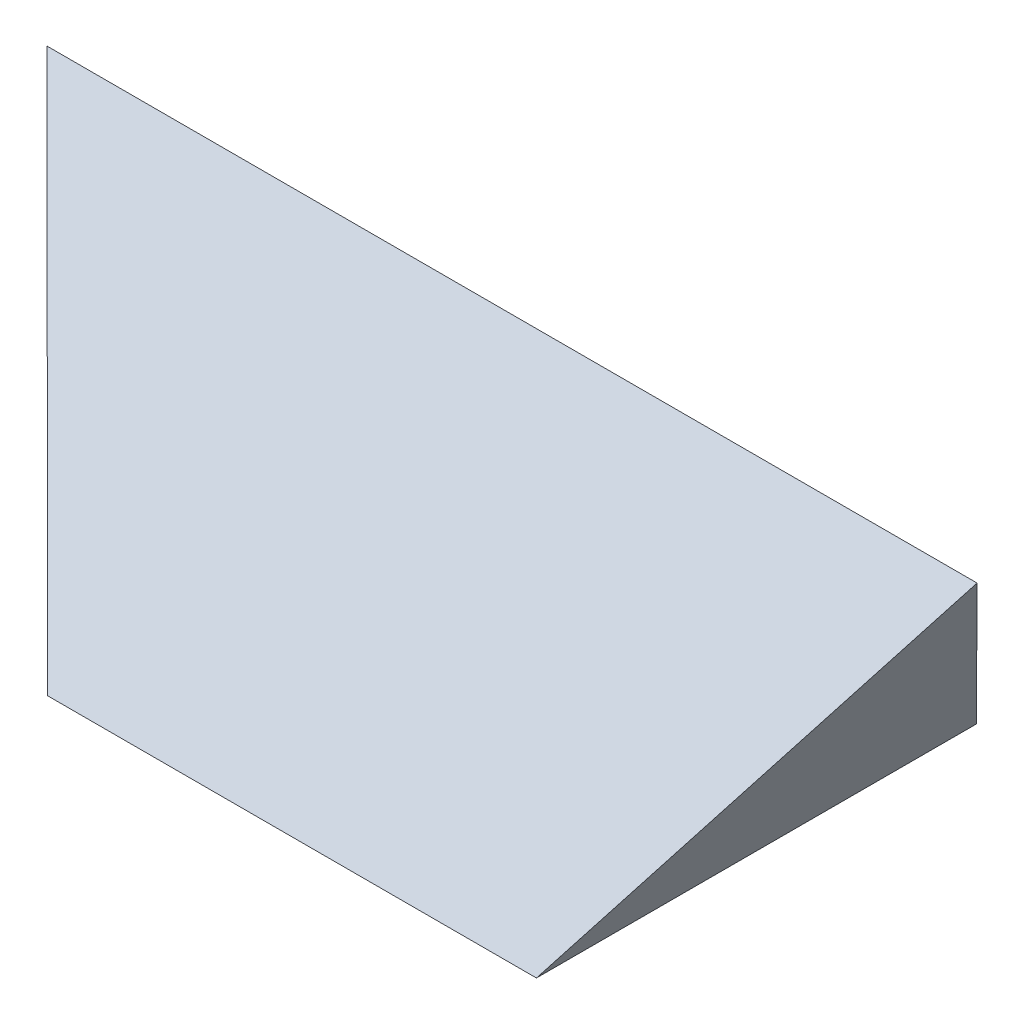
ISO-10303-21;
HEADER;
FILE_DESCRIPTION(('STEP AP214'),'2;1');
FILE_NAME('part.step','',(''),(''),'','','');
FILE_SCHEMA(('AUTOMOTIVE_DESIGN { 1 0 10303 214 1 1 1 1 }'));
ENDSEC;
DATA;
#1=APPLICATION_CONTEXT('core data for automotive mechanical design processes');
#2=APPLICATION_PROTOCOL_DEFINITION('international standard','automotive_design',2000,#1);
#3=PRODUCT_CONTEXT('',#1,'mechanical');
#4=PRODUCT('Part','Part','',(#3));
#5=PRODUCT_RELATED_PRODUCT_CATEGORY('part','',(#4));
#6=PRODUCT_DEFINITION_FORMATION('','',#4);
#7=PRODUCT_DEFINITION_CONTEXT('part definition',#1,'design');
#8=PRODUCT_DEFINITION('design','',#6,#7);
#9=PRODUCT_DEFINITION_SHAPE('','',#8);
#10=(LENGTH_UNIT() NAMED_UNIT(*) SI_UNIT(.MILLI.,.METRE.));
#11=(NAMED_UNIT(*) PLANE_ANGLE_UNIT() SI_UNIT($,.RADIAN.));
#12=(NAMED_UNIT(*) SI_UNIT($,.STERADIAN.) SOLID_ANGLE_UNIT());
#13=UNCERTAINTY_MEASURE_WITH_UNIT(LENGTH_MEASURE(1.E-05),#10,'distance_accuracy_value','');
#14=(GEOMETRIC_REPRESENTATION_CONTEXT(3) GLOBAL_UNCERTAINTY_ASSIGNED_CONTEXT((#13)) GLOBAL_UNIT_ASSIGNED_CONTEXT((#10,
#11,#12)) REPRESENTATION_CONTEXT('',''));
#15=CARTESIAN_POINT('',(0.,0.,0.));
#16=DIRECTION('',(0.,0.,1.));
#17=DIRECTION('',(1.,0.,0.));
#18=AXIS2_PLACEMENT_3D('',#15,#16,#17);
#19=CARTESIAN_POINT('',(28.54327410029,21.0137984820549,27.));
#20=DIRECTION('',(0.840551939282198,-0.5417309640116,0.));
#21=DIRECTION('',(0.5417309640116,0.840551939282198,0.));
#22=AXIS2_PLACEMENT_3D('',#19,#20,#21);
#23=PLANE('',#22);
#24=DIRECTION('',(0.476671999311841,0.739606188385626,-0.475148914734884));
#25=VECTOR('',#24,1.);
#26=CARTESIAN_POINT('',(25.4856566276634,16.2695869325294,16.5478476308455));
#27=LINE('',#26,#25);
#28=CARTESIAN_POINT('',(15.,0.,27.));
#29=VERTEX_POINT('',#28);
#30=CARTESIAN_POINT('',(28.54327410029,21.0137984820549,13.5));
#31=VERTEX_POINT('',#30);
#32=EDGE_CURVE('E71',#29,#31,#27,.T.);
#33=ORIENTED_EDGE('',*,*,#32,.F.);
#34=DIRECTION('',(0.,0.,-1.));
#35=VECTOR('',#34,1.);
#36=CARTESIAN_POINT('',(15.,0.,27.));
#37=LINE('',#36,#35);
#38=CARTESIAN_POINT('',(15.,0.,0.));
#39=VERTEX_POINT('',#38);
#40=EDGE_CURVE('E37',#29,#39,#37,.T.);
#41=ORIENTED_EDGE('',*,*,#40,.T.);
#42=DIRECTION('',(0.476671999311841,0.739606188385626,0.475148914734884));
#43=VECTOR('',#42,1.);
#44=CARTESIAN_POINT('',(31.6008915729166,25.7580100315805,16.5478476308455));
#45=LINE('',#44,#43);
#46=EDGE_CURVE('E48',#39,#31,#45,.T.);
#47=ORIENTED_EDGE('',*,*,#46,.T.);
#48=EDGE_LOOP('',(#33,#41,#47));
#49=FACE_BOUND('',#48,.T.);
#50=ADVANCED_FACE('F34',(#49),#23,.T.);
#51=CARTESIAN_POINT('',(-28.54327410029,21.0137984820549,27.));
#52=DIRECTION('',(0.840551939282198,0.5417309640116,0.));
#53=DIRECTION('',(-0.5417309640116,0.840551939282198,0.));
#54=AXIS2_PLACEMENT_3D('',#51,#52,#53);
#55=PLANE('',#54);
#56=DIRECTION('',(0.,0.,-1.));
#57=VECTOR('',#56,1.);
#58=CARTESIAN_POINT('',(-15.,0.,27.));
#59=LINE('',#58,#57);
#60=CARTESIAN_POINT('',(-15.,0.,27.));
#61=VERTEX_POINT('',#60);
#62=CARTESIAN_POINT('',(-15.,0.,0.));
#63=VERTEX_POINT('',#62);
#64=EDGE_CURVE('E11',#61,#63,#59,.T.);
#65=ORIENTED_EDGE('',*,*,#64,.F.);
#66=DIRECTION('',(-0.476671999311841,0.739606188385626,-0.475148914734884));
#67=VECTOR('',#66,1.);
#68=CARTESIAN_POINT('',(-25.4856566276634,16.2695869325294,16.5478476308455));
#69=LINE('',#68,#67);
#70=CARTESIAN_POINT('',(-28.54327410029,21.0137984820549,13.5));
#71=VERTEX_POINT('',#70);
#72=EDGE_CURVE('E73',#61,#71,#69,.T.);
#73=ORIENTED_EDGE('',*,*,#72,.T.);
#74=DIRECTION('',(-0.476671999311841,0.739606188385626,0.475148914734884));
#75=VECTOR('',#74,1.);
#76=CARTESIAN_POINT('',(-31.6008915729166,25.7580100315805,16.5478476308455));
#77=LINE('',#76,#75);
#78=EDGE_CURVE('E83',#63,#71,#77,.T.);
#79=ORIENTED_EDGE('',*,*,#78,.F.);
#80=EDGE_LOOP('',(#65,#73,#79));
#81=FACE_BOUND('',#80,.T.);
#82=ADVANCED_FACE('F89',(#81),#55,.F.);
#83=CARTESIAN_POINT('',(15.,0.,27.));
#84=DIRECTION('',(0.,-1.,0.));
#85=DIRECTION('',(0.,0.,-1.));
#86=AXIS2_PLACEMENT_3D('',#83,#84,#85);
#87=PLANE('',#86);
#88=DIRECTION('',(-1.,0.,0.));
#89=VECTOR('',#88,1.);
#90=CARTESIAN_POINT('',(15.,0.,0.));
#91=LINE('',#90,#89);
#92=EDGE_CURVE('E53',#39,#63,#91,.T.);
#93=ORIENTED_EDGE('',*,*,#92,.F.);
#94=ORIENTED_EDGE('',*,*,#40,.F.);
#95=DIRECTION('',(-1.,0.,0.));
#96=VECTOR('',#95,1.);
#97=CARTESIAN_POINT('',(15.,0.,27.));
#98=LINE('',#97,#96);
#99=EDGE_CURVE('E68',#29,#61,#98,.T.);
#100=ORIENTED_EDGE('',*,*,#99,.T.);
#101=ORIENTED_EDGE('',*,*,#64,.T.);
#102=EDGE_LOOP('',(#93,#94,#100,#101));
#103=FACE_BOUND('',#102,.T.);
#104=ADVANCED_FACE('F81',(#103),#87,.T.);
#105=CARTESIAN_POINT('',(37.,21.0137984820549,13.5));
#106=DIRECTION('',(0.,0.540506269168636,-0.841339986562746));
#107=DIRECTION('',(0.,0.841339986562746,0.540506269168636));
#108=AXIS2_PLACEMENT_3D('',#105,#106,#107);
#109=PLANE('',#108);
#110=ORIENTED_EDGE('',*,*,#92,.T.);
#111=ORIENTED_EDGE('',*,*,#78,.T.);
#112=DIRECTION('',(-1.,0.,0.));
#113=VECTOR('',#112,1.);
#114=CARTESIAN_POINT('',(37.,21.0137984820549,13.5));
#115=LINE('',#114,#113);
#116=EDGE_CURVE('E79',#31,#71,#115,.T.);
#117=ORIENTED_EDGE('',*,*,#116,.F.);
#118=ORIENTED_EDGE('',*,*,#46,.F.);
#119=EDGE_LOOP('',(#110,#111,#117,#118));
#120=FACE_BOUND('',#119,.T.);
#121=ADVANCED_FACE('F90',(#120),#109,.T.);
#122=CARTESIAN_POINT('',(37.,21.0137984820549,13.5));
#123=DIRECTION('',(0.,-0.540506269168636,-0.841339986562746));
#124=DIRECTION('',(0.,0.841339986562746,-0.540506269168636));
#125=AXIS2_PLACEMENT_3D('',#122,#123,#124);
#126=PLANE('',#125);
#127=ORIENTED_EDGE('',*,*,#32,.T.);
#128=ORIENTED_EDGE('',*,*,#116,.T.);
#129=ORIENTED_EDGE('',*,*,#72,.F.);
#130=ORIENTED_EDGE('',*,*,#99,.F.);
#131=EDGE_LOOP('',(#127,#128,#129,#130));
#132=FACE_BOUND('',#131,.T.);
#133=ADVANCED_FACE('F70',(#132),#126,.F.);
#134=CLOSED_SHELL('',(#50,#82,#104,#121,#133));
#135=MANIFOLD_SOLID_BREP('B2',#134);
#136=ADVANCED_BREP_SHAPE_REPRESENTATION('',(#18,#135),#14);
#137=SHAPE_DEFINITION_REPRESENTATION(#9,#136);
ENDSEC;
END-ISO-10303-21;
